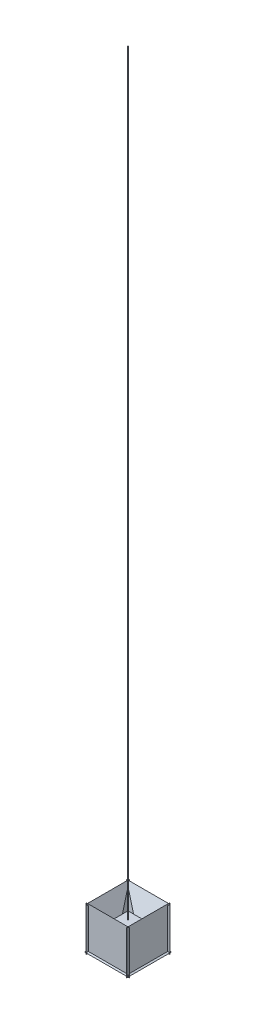
ISO-10303-21;
HEADER;
FILE_DESCRIPTION(('STEP AP214'),'2;1');
FILE_NAME('part.step','',(''),(''),'','','');
FILE_SCHEMA(('AUTOMOTIVE_DESIGN { 1 0 10303 214 1 1 1 1 }'));
ENDSEC;
DATA;
#1=APPLICATION_CONTEXT('core data for automotive mechanical design processes');
#2=APPLICATION_PROTOCOL_DEFINITION('international standard','automotive_design',2000,#1);
#3=PRODUCT_CONTEXT('',#1,'mechanical');
#4=PRODUCT('Part','Part','',(#3));
#5=PRODUCT_RELATED_PRODUCT_CATEGORY('part','',(#4));
#6=PRODUCT_DEFINITION_FORMATION('','',#4);
#7=PRODUCT_DEFINITION_CONTEXT('part definition',#1,'design');
#8=PRODUCT_DEFINITION('design','',#6,#7);
#9=PRODUCT_DEFINITION_SHAPE('','',#8);
#10=(LENGTH_UNIT() NAMED_UNIT(*) SI_UNIT(.MILLI.,.METRE.));
#11=(NAMED_UNIT(*) PLANE_ANGLE_UNIT() SI_UNIT($,.RADIAN.));
#12=(NAMED_UNIT(*) SI_UNIT($,.STERADIAN.) SOLID_ANGLE_UNIT());
#13=UNCERTAINTY_MEASURE_WITH_UNIT(LENGTH_MEASURE(1.E-05),#10,'distance_accuracy_value','');
#14=(GEOMETRIC_REPRESENTATION_CONTEXT(3) GLOBAL_UNCERTAINTY_ASSIGNED_CONTEXT((#13)) GLOBAL_UNIT_ASSIGNED_CONTEXT((#10,
#11,#12)) REPRESENTATION_CONTEXT('',''));
#15=CARTESIAN_POINT('',(0.,0.,0.));
#16=DIRECTION('',(0.,0.,1.));
#17=DIRECTION('',(1.,0.,0.));
#18=AXIS2_PLACEMENT_3D('',#15,#16,#17);
#19=CARTESIAN_POINT('',(267.74991161534,0.,-2.80453145964557E-12));
#20=DIRECTION('',(-1.,0.,0.));
#21=DIRECTION('',(0.,0.,1.));
#22=AXIS2_PLACEMENT_3D('',#19,#20,#21);
#23=PLANE('',#22);
#24=DIRECTION('',(0.,-1.,0.));
#25=VECTOR('',#24,1.);
#26=CARTESIAN_POINT('',(267.749911615337,-287.780088590849,-287.780088590851));
#27=LINE('',#26,#25);
#28=CARTESIAN_POINT('',(267.749911615337,287.780088590849,-287.780088590851));
#29=VERTEX_POINT('',#28);
#30=CARTESIAN_POINT('',(267.749911615337,-287.780088590849,-287.780088590851));
#31=VERTEX_POINT('',#30);
#32=EDGE_CURVE('E142',#29,#31,#27,.T.);
#33=ORIENTED_EDGE('',*,*,#32,.F.);
#34=DIRECTION('',(0.,0.,-1.));
#35=VECTOR('',#34,1.);
#36=CARTESIAN_POINT('',(267.749911615343,287.780088590849,287.780088590846));
#37=LINE('',#36,#35);
#38=CARTESIAN_POINT('',(267.749911615343,287.780088590849,287.780088590846));
#39=VERTEX_POINT('',#38);
#40=EDGE_CURVE('E72',#39,#29,#37,.T.);
#41=ORIENTED_EDGE('',*,*,#40,.F.);
#42=DIRECTION('',(0.,1.,0.));
#43=VECTOR('',#42,1.);
#44=CARTESIAN_POINT('',(267.749911615343,-287.780088590849,287.780088590846));
#45=LINE('',#44,#43);
#46=CARTESIAN_POINT('',(267.749911615343,-287.780088590849,287.780088590846));
#47=VERTEX_POINT('',#46);
#48=EDGE_CURVE('E80',#47,#39,#45,.T.);
#49=ORIENTED_EDGE('',*,*,#48,.F.);
#50=DIRECTION('',(0.,0.,1.));
#51=VECTOR('',#50,1.);
#52=CARTESIAN_POINT('',(267.749911615343,-287.780088590849,287.780088590846));
#53=LINE('',#52,#51);
#54=EDGE_CURVE('E96',#31,#47,#53,.T.);
#55=ORIENTED_EDGE('',*,*,#54,.F.);
#56=EDGE_LOOP('',(#33,#41,#49,#55));
#57=FACE_BOUND('',#56,.T.);
#58=ADVANCED_FACE('F52',(#57),#23,.F.);
#59=CARTESIAN_POINT('',(76.1999999999998,0.,-43.9940905122502));
#60=DIRECTION('',(-0.866025403784435,0.,0.500000000000007));
#61=DIRECTION('',(0.500000000000007,0.,0.866025403784435));
#62=AXIS2_PLACEMENT_3D('',#59,#60,#61);
#63=PLANE('',#62);
#64=DIRECTION('',(0.377964473009232,-0.654653670707978,0.654653670707974));
#65=VECTOR('',#64,1.);
#66=CARTESIAN_POINT('',(101.6,0.,-1.06420351207939E-12));
#67=LINE('',#66,#65);
#68=CARTESIAN_POINT('',(101.6,0.,-1.06420351207939E-12));
#69=VERTEX_POINT('',#68);
#70=EDGE_CURVE('E90',#69,#47,#67,.T.);
#71=ORIENTED_EDGE('',*,*,#70,.T.);
#72=ORIENTED_EDGE('',*,*,#48,.T.);
#73=DIRECTION('',(0.377964473009232,0.654653670707978,0.654653670707974));
#74=VECTOR('',#73,1.);
#75=CARTESIAN_POINT('',(101.6,0.,-1.06420351207939E-12));
#76=LINE('',#75,#74);
#77=EDGE_CURVE('E93',#69,#39,#76,.T.);
#78=ORIENTED_EDGE('',*,*,#77,.F.);
#79=EDGE_LOOP('',(#71,#72,#78));
#80=FACE_BOUND('',#79,.T.);
#81=ADVANCED_FACE('F92',(#80),#63,.T.);
#82=CARTESIAN_POINT('',(76.2000000000002,-43.9940905122494,-7.98152634059543E-13));
#83=DIRECTION('',(-0.86602540378444,0.499999999999998,0.));
#84=DIRECTION('',(-0.499999999999998,-0.86602540378444,0.));
#85=AXIS2_PLACEMENT_3D('',#82,#83,#84);
#86=PLANE('',#85);
#87=ORIENTED_EDGE('',*,*,#77,.T.);
#88=ORIENTED_EDGE('',*,*,#40,.T.);
#89=DIRECTION('',(0.377964473009219,0.654653670707978,-0.654653670707982));
#90=VECTOR('',#89,1.);
#91=CARTESIAN_POINT('',(101.6,0.,-1.06420351207939E-12));
#92=LINE('',#91,#90);
#93=EDGE_CURVE('E13',#69,#29,#92,.T.);
#94=ORIENTED_EDGE('',*,*,#93,.F.);
#95=EDGE_LOOP('',(#87,#88,#94));
#96=FACE_BOUND('',#95,.T.);
#97=ADVANCED_FACE('F164',(#96),#86,.T.);
#98=CARTESIAN_POINT('',(76.2000000000002,43.9940905122494,-7.98152634059543E-13));
#99=DIRECTION('',(-0.86602540378444,-0.499999999999998,0.));
#100=DIRECTION('',(0.499999999999998,-0.86602540378444,0.));
#101=AXIS2_PLACEMENT_3D('',#98,#99,#100);
#102=PLANE('',#101);
#103=DIRECTION('',(0.377964473009219,-0.654653670707978,-0.654653670707982));
#104=VECTOR('',#103,1.);
#105=CARTESIAN_POINT('',(101.6,0.,-1.06420351207939E-12));
#106=LINE('',#105,#104);
#107=EDGE_CURVE('E64',#69,#31,#106,.T.);
#108=ORIENTED_EDGE('',*,*,#107,.T.);
#109=ORIENTED_EDGE('',*,*,#54,.T.);
#110=ORIENTED_EDGE('',*,*,#70,.F.);
#111=EDGE_LOOP('',(#108,#109,#110));
#112=FACE_BOUND('',#111,.T.);
#113=ADVANCED_FACE('F99',(#112),#102,.T.);
#114=CARTESIAN_POINT('',(76.2000000000007,0.,43.9940905122486));
#115=DIRECTION('',(-0.866025403784445,0.,-0.499999999999989));
#116=DIRECTION('',(-0.499999999999989,0.,0.866025403784445));
#117=AXIS2_PLACEMENT_3D('',#114,#115,#116);
#118=PLANE('',#117);
#119=ORIENTED_EDGE('',*,*,#93,.T.);
#120=ORIENTED_EDGE('',*,*,#32,.T.);
#121=ORIENTED_EDGE('',*,*,#107,.F.);
#122=EDGE_LOOP('',(#119,#120,#121));
#123=FACE_BOUND('',#122,.T.);
#124=ADVANCED_FACE('F54',(#123),#118,.T.);
#125=CLOSED_SHELL('',(#58,#81,#97,#113,#124));
#126=MANIFOLD_SOLID_BREP('B2',#125);
#127=CARTESIAN_POINT('',(0.,0.,267.74991161534));
#128=DIRECTION('',(0.,0.,-1.));
#129=DIRECTION('',(-1.,0.,0.));
#130=AXIS2_PLACEMENT_3D('',#127,#128,#129);
#131=PLANE('',#130);
#132=DIRECTION('',(0.,-1.,0.));
#133=VECTOR('',#132,1.);
#134=CARTESIAN_POINT('',(287.780088590849,-287.780088590849,267.74991161534));
#135=LINE('',#134,#133);
#136=CARTESIAN_POINT('',(287.780088590849,287.780088590849,267.74991161534));
#137=VERTEX_POINT('',#136);
#138=CARTESIAN_POINT('',(287.780088590849,-287.780088590849,267.74991161534));
#139=VERTEX_POINT('',#138);
#140=EDGE_CURVE('E350',#137,#139,#135,.T.);
#141=ORIENTED_EDGE('',*,*,#140,.F.);
#142=DIRECTION('',(1.,0.,0.));
#143=VECTOR('',#142,1.);
#144=CARTESIAN_POINT('',(-287.780088590849,287.780088590849,267.74991161534));
#145=LINE('',#144,#143);
#146=CARTESIAN_POINT('',(-287.780088590849,287.780088590849,267.74991161534));
#147=VERTEX_POINT('',#146);
#148=EDGE_CURVE('E280',#147,#137,#145,.T.);
#149=ORIENTED_EDGE('',*,*,#148,.F.);
#150=DIRECTION('',(0.,1.,0.));
#151=VECTOR('',#150,1.);
#152=CARTESIAN_POINT('',(-287.780088590849,-287.780088590849,267.74991161534));
#153=LINE('',#152,#151);
#154=CARTESIAN_POINT('',(-287.780088590849,-287.780088590849,267.74991161534));
#155=VERTEX_POINT('',#154);
#156=EDGE_CURVE('E288',#155,#147,#153,.T.);
#157=ORIENTED_EDGE('',*,*,#156,.F.);
#158=DIRECTION('',(-1.,0.,0.));
#159=VECTOR('',#158,1.);
#160=CARTESIAN_POINT('',(-287.780088590849,-287.780088590849,267.74991161534));
#161=LINE('',#160,#159);
#162=EDGE_CURVE('E304',#139,#155,#161,.T.);
#163=ORIENTED_EDGE('',*,*,#162,.F.);
#164=EDGE_LOOP('',(#141,#149,#157,#163));
#165=FACE_BOUND('',#164,.T.);
#166=ADVANCED_FACE('F260',(#165),#131,.F.);
#167=CARTESIAN_POINT('',(43.9940905122494,0.,76.2000000000002));
#168=DIRECTION('',(-0.499999999999998,0.,-0.86602540378444));
#169=DIRECTION('',(-0.86602540378444,0.,0.499999999999998));
#170=AXIS2_PLACEMENT_3D('',#167,#168,#169);
#171=PLANE('',#170);
#172=DIRECTION('',(-0.654653670707978,-0.654653670707978,0.377964473009226));
#173=VECTOR('',#172,1.);
#174=CARTESIAN_POINT('',(0.,0.,101.6));
#175=LINE('',#174,#173);
#176=CARTESIAN_POINT('',(0.,0.,101.6));
#177=VERTEX_POINT('',#176);
#178=EDGE_CURVE('E298',#177,#155,#175,.T.);
#179=ORIENTED_EDGE('',*,*,#178,.T.);
#180=ORIENTED_EDGE('',*,*,#156,.T.);
#181=DIRECTION('',(-0.654653670707978,0.654653670707978,0.377964473009226));
#182=VECTOR('',#181,1.);
#183=CARTESIAN_POINT('',(0.,0.,101.6));
#184=LINE('',#183,#182);
#185=EDGE_CURVE('E301',#177,#147,#184,.T.);
#186=ORIENTED_EDGE('',*,*,#185,.F.);
#187=EDGE_LOOP('',(#179,#180,#186));
#188=FACE_BOUND('',#187,.T.);
#189=ADVANCED_FACE('F300',(#188),#171,.T.);
#190=CARTESIAN_POINT('',(0.,-43.9940905122494,76.2000000000002));
#191=DIRECTION('',(0.,0.499999999999998,-0.86602540378444));
#192=DIRECTION('',(0.,-0.86602540378444,-0.499999999999998));
#193=AXIS2_PLACEMENT_3D('',#190,#191,#192);
#194=PLANE('',#193);
#195=ORIENTED_EDGE('',*,*,#185,.T.);
#196=ORIENTED_EDGE('',*,*,#148,.T.);
#197=DIRECTION('',(0.654653670707978,0.654653670707978,0.377964473009226));
#198=VECTOR('',#197,1.);
#199=CARTESIAN_POINT('',(0.,0.,101.6));
#200=LINE('',#199,#198);
#201=EDGE_CURVE('E50',#177,#137,#200,.T.);
#202=ORIENTED_EDGE('',*,*,#201,.F.);
#203=EDGE_LOOP('',(#195,#196,#202));
#204=FACE_BOUND('',#203,.T.);
#205=ADVANCED_FACE('F372',(#204),#194,.T.);
#206=CARTESIAN_POINT('',(0.,43.9940905122494,76.2000000000002));
#207=DIRECTION('',(0.,-0.499999999999998,-0.86602540378444));
#208=DIRECTION('',(0.,-0.86602540378444,0.499999999999998));
#209=AXIS2_PLACEMENT_3D('',#206,#207,#208);
#210=PLANE('',#209);
#211=DIRECTION('',(0.654653670707978,-0.654653670707978,0.377964473009226));
#212=VECTOR('',#211,1.);
#213=CARTESIAN_POINT('',(0.,0.,101.6));
#214=LINE('',#213,#212);
#215=EDGE_CURVE('E272',#177,#139,#214,.T.);
#216=ORIENTED_EDGE('',*,*,#215,.T.);
#217=ORIENTED_EDGE('',*,*,#162,.T.);
#218=ORIENTED_EDGE('',*,*,#178,.F.);
#219=EDGE_LOOP('',(#216,#217,#218));
#220=FACE_BOUND('',#219,.T.);
#221=ADVANCED_FACE('F307',(#220),#210,.T.);
#222=CARTESIAN_POINT('',(-43.9940905122494,0.,76.2000000000002));
#223=DIRECTION('',(0.499999999999998,0.,-0.86602540378444));
#224=DIRECTION('',(-0.86602540378444,0.,-0.499999999999998));
#225=AXIS2_PLACEMENT_3D('',#222,#223,#224);
#226=PLANE('',#225);
#227=ORIENTED_EDGE('',*,*,#201,.T.);
#228=ORIENTED_EDGE('',*,*,#140,.T.);
#229=ORIENTED_EDGE('',*,*,#215,.F.);
#230=EDGE_LOOP('',(#227,#228,#229));
#231=FACE_BOUND('',#230,.T.);
#232=ADVANCED_FACE('F262',(#231),#226,.T.);
#233=CLOSED_SHELL('',(#166,#189,#205,#221,#232));
#234=MANIFOLD_SOLID_BREP('B7',#233);
#235=CARTESIAN_POINT('',(-267.74991161534,0.,9.34843819881858E-13));
#236=DIRECTION('',(1.,0.,0.));
#237=DIRECTION('',(0.,0.,-1.));
#238=AXIS2_PLACEMENT_3D('',#235,#236,#237);
#239=PLANE('',#238);
#240=DIRECTION('',(0.,-1.,0.));
#241=VECTOR('',#240,1.);
#242=CARTESIAN_POINT('',(-267.749911615339,-287.780088590849,287.780088590849));
#243=LINE('',#242,#241);
#244=CARTESIAN_POINT('',(-267.749911615339,287.780088590849,287.780088590849));
#245=VERTEX_POINT('',#244);
#246=CARTESIAN_POINT('',(-267.749911615339,-287.780088590849,287.780088590849));
#247=VERTEX_POINT('',#246);
#248=EDGE_CURVE('E558',#245,#247,#243,.T.);
#249=ORIENTED_EDGE('',*,*,#248,.F.);
#250=DIRECTION('',(0.,0.,1.));
#251=VECTOR('',#250,1.);
#252=CARTESIAN_POINT('',(-267.749911615341,287.780088590849,-287.780088590848));
#253=LINE('',#252,#251);
#254=CARTESIAN_POINT('',(-267.749911615341,287.780088590849,-287.780088590848));
#255=VERTEX_POINT('',#254);
#256=EDGE_CURVE('E488',#255,#245,#253,.T.);
#257=ORIENTED_EDGE('',*,*,#256,.F.);
#258=DIRECTION('',(0.,1.,0.));
#259=VECTOR('',#258,1.);
#260=CARTESIAN_POINT('',(-267.749911615341,-287.780088590849,-287.780088590848));
#261=LINE('',#260,#259);
#262=CARTESIAN_POINT('',(-267.749911615341,-287.780088590849,-287.780088590848));
#263=VERTEX_POINT('',#262);
#264=EDGE_CURVE('E496',#263,#255,#261,.T.);
#265=ORIENTED_EDGE('',*,*,#264,.F.);
#266=DIRECTION('',(0.,0.,-1.));
#267=VECTOR('',#266,1.);
#268=CARTESIAN_POINT('',(-267.749911615341,-287.780088590849,-287.780088590848));
#269=LINE('',#268,#267);
#270=EDGE_CURVE('E512',#247,#263,#269,.T.);
#271=ORIENTED_EDGE('',*,*,#270,.F.);
#272=EDGE_LOOP('',(#249,#257,#265,#271));
#273=FACE_BOUND('',#272,.T.);
#274=ADVANCED_FACE('F468',(#273),#239,.F.);
#275=CARTESIAN_POINT('',(-76.2000000000001,0.,43.9940905122496));
#276=DIRECTION('',(0.866025403784438,0.,-0.500000000000001));
#277=DIRECTION('',(-0.500000000000001,0.,-0.866025403784438));
#278=AXIS2_PLACEMENT_3D('',#275,#276,#277);
#279=PLANE('',#278);
#280=DIRECTION('',(-0.377964473009228,-0.654653670707978,-0.654653670707976));
#281=VECTOR('',#280,1.);
#282=CARTESIAN_POINT('',(-101.6,0.,3.54734504026462E-13));
#283=LINE('',#282,#281);
#284=CARTESIAN_POINT('',(-101.6,0.,3.54734504026462E-13));
#285=VERTEX_POINT('',#284);
#286=EDGE_CURVE('E506',#285,#263,#283,.T.);
#287=ORIENTED_EDGE('',*,*,#286,.T.);
#288=ORIENTED_EDGE('',*,*,#264,.T.);
#289=DIRECTION('',(-0.377964473009228,0.654653670707978,-0.654653670707976));
#290=VECTOR('',#289,1.);
#291=CARTESIAN_POINT('',(-101.6,0.,3.54734504026462E-13));
#292=LINE('',#291,#290);
#293=EDGE_CURVE('E509',#285,#255,#292,.T.);
#294=ORIENTED_EDGE('',*,*,#293,.F.);
#295=EDGE_LOOP('',(#287,#288,#294));
#296=FACE_BOUND('',#295,.T.);
#297=ADVANCED_FACE('F508',(#296),#279,.T.);
#298=CARTESIAN_POINT('',(-76.2000000000002,-43.9940905122494,2.66050878019848E-13));
#299=DIRECTION('',(0.86602540378444,0.499999999999998,0.));
#300=DIRECTION('',(0.499999999999998,-0.86602540378444,0.));
#301=AXIS2_PLACEMENT_3D('',#298,#299,#300);
#302=PLANE('',#301);
#303=ORIENTED_EDGE('',*,*,#293,.T.);
#304=ORIENTED_EDGE('',*,*,#256,.T.);
#305=DIRECTION('',(-0.377964473009223,0.654653670707978,0.654653670707979));
#306=VECTOR('',#305,1.);
#307=CARTESIAN_POINT('',(-101.6,0.,3.54734504026462E-13));
#308=LINE('',#307,#306);
#309=EDGE_CURVE('E258',#285,#245,#308,.T.);
#310=ORIENTED_EDGE('',*,*,#309,.F.);
#311=EDGE_LOOP('',(#303,#304,#310));
#312=FACE_BOUND('',#311,.T.);
#313=ADVANCED_FACE('F580',(#312),#302,.T.);
#314=CARTESIAN_POINT('',(-76.2000000000002,43.9940905122494,2.66050878019848E-13));
#315=DIRECTION('',(0.86602540378444,-0.499999999999998,0.));
#316=DIRECTION('',(-0.499999999999998,-0.86602540378444,0.));
#317=AXIS2_PLACEMENT_3D('',#314,#315,#316);
#318=PLANE('',#317);
#319=DIRECTION('',(-0.377964473009223,-0.654653670707978,0.654653670707979));
#320=VECTOR('',#319,1.);
#321=CARTESIAN_POINT('',(-101.6,0.,3.54734504026462E-13));
#322=LINE('',#321,#320);
#323=EDGE_CURVE('E480',#285,#247,#322,.T.);
#324=ORIENTED_EDGE('',*,*,#323,.T.);
#325=ORIENTED_EDGE('',*,*,#270,.T.);
#326=ORIENTED_EDGE('',*,*,#286,.F.);
#327=EDGE_LOOP('',(#324,#325,#326));
#328=FACE_BOUND('',#327,.T.);
#329=ADVANCED_FACE('F515',(#328),#318,.T.);
#330=CARTESIAN_POINT('',(-76.2000000000004,0.,-43.9940905122491));
#331=DIRECTION('',(0.866025403784442,0.,0.499999999999995));
#332=DIRECTION('',(0.499999999999995,0.,-0.866025403784442));
#333=AXIS2_PLACEMENT_3D('',#330,#331,#332);
#334=PLANE('',#333);
#335=ORIENTED_EDGE('',*,*,#309,.T.);
#336=ORIENTED_EDGE('',*,*,#248,.T.);
#337=ORIENTED_EDGE('',*,*,#323,.F.);
#338=EDGE_LOOP('',(#335,#336,#337));
#339=FACE_BOUND('',#338,.T.);
#340=ADVANCED_FACE('F470',(#339),#334,.T.);
#341=CLOSED_SHELL('',(#274,#297,#313,#329,#340));
#342=MANIFOLD_SOLID_BREP('B44',#341);
#343=CARTESIAN_POINT('',(0.,0.,267.74991161534));
#344=DIRECTION('',(0.,0.,-1.));
#345=DIRECTION('',(1.,0.,0.));
#346=AXIS2_PLACEMENT_3D('',#343,#344,#345);
#347=PLANE('',#346);
#348=DIRECTION('',(0.,1.,0.));
#349=VECTOR('',#348,1.);
#350=CARTESIAN_POINT('',(-287.780088590849,287.780088590848,267.74991161534));
#351=LINE('',#350,#349);
#352=CARTESIAN_POINT('',(-287.780088590848,-287.780088590849,267.74991161534));
#353=VERTEX_POINT('',#352);
#354=CARTESIAN_POINT('',(-287.780088590849,287.780088590848,267.74991161534));
#355=VERTEX_POINT('',#354);
#356=EDGE_CURVE('E766',#353,#355,#351,.T.);
#357=ORIENTED_EDGE('',*,*,#356,.F.);
#358=DIRECTION('',(-1.,0.,0.));
#359=VECTOR('',#358,1.);
#360=CARTESIAN_POINT('',(287.780088590849,-287.780088590848,267.74991161534));
#361=LINE('',#360,#359);
#362=CARTESIAN_POINT('',(287.780088590849,-287.780088590848,267.74991161534));
#363=VERTEX_POINT('',#362);
#364=EDGE_CURVE('E696',#363,#353,#361,.T.);
#365=ORIENTED_EDGE('',*,*,#364,.F.);
#366=DIRECTION('',(0.,-1.,0.));
#367=VECTOR('',#366,1.);
#368=CARTESIAN_POINT('',(287.780088590848,287.780088590849,267.74991161534));
#369=LINE('',#368,#367);
#370=CARTESIAN_POINT('',(287.780088590848,287.780088590849,267.74991161534));
#371=VERTEX_POINT('',#370);
#372=EDGE_CURVE('E704',#371,#363,#369,.T.);
#373=ORIENTED_EDGE('',*,*,#372,.F.);
#374=DIRECTION('',(1.,0.,0.));
#375=VECTOR('',#374,1.);
#376=CARTESIAN_POINT('',(287.780088590848,287.780088590849,267.74991161534));
#377=LINE('',#376,#375);
#378=EDGE_CURVE('E720',#355,#371,#377,.T.);
#379=ORIENTED_EDGE('',*,*,#378,.F.);
#380=EDGE_LOOP('',(#357,#365,#373,#379));
#381=FACE_BOUND('',#380,.T.);
#382=ADVANCED_FACE('F676',(#381),#347,.F.);
#383=CARTESIAN_POINT('',(-43.9940905122494,0.,76.2000000000002));
#384=DIRECTION('',(0.499999999999998,0.,-0.86602540378444));
#385=DIRECTION('',(0.86602540378444,0.,0.499999999999998));
#386=AXIS2_PLACEMENT_3D('',#383,#384,#385);
#387=PLANE('',#386);
#388=DIRECTION('',(0.654653670707977,0.654653670707978,0.377964473009226));
#389=VECTOR('',#388,1.);
#390=CARTESIAN_POINT('',(0.,0.,101.6));
#391=LINE('',#390,#389);
#392=CARTESIAN_POINT('',(0.,0.,101.6));
#393=VERTEX_POINT('',#392);
#394=EDGE_CURVE('E714',#393,#371,#391,.T.);
#395=ORIENTED_EDGE('',*,*,#394,.T.);
#396=ORIENTED_EDGE('',*,*,#372,.T.);
#397=DIRECTION('',(0.654653670707978,-0.654653670707977,0.377964473009226));
#398=VECTOR('',#397,1.);
#399=CARTESIAN_POINT('',(0.,0.,101.6));
#400=LINE('',#399,#398);
#401=EDGE_CURVE('E717',#393,#363,#400,.T.);
#402=ORIENTED_EDGE('',*,*,#401,.F.);
#403=EDGE_LOOP('',(#395,#396,#402));
#404=FACE_BOUND('',#403,.T.);
#405=ADVANCED_FACE('F716',(#404),#387,.T.);
#406=CARTESIAN_POINT('',(0.,43.9940905122494,76.2000000000002));
#407=DIRECTION('',(0.,-0.499999999999998,-0.86602540378444));
#408=DIRECTION('',(0.,0.86602540378444,-0.499999999999998));
#409=AXIS2_PLACEMENT_3D('',#406,#407,#408);
#410=PLANE('',#409);
#411=ORIENTED_EDGE('',*,*,#401,.T.);
#412=ORIENTED_EDGE('',*,*,#364,.T.);
#413=DIRECTION('',(-0.654653670707977,-0.654653670707978,0.377964473009226));
#414=VECTOR('',#413,1.);
#415=CARTESIAN_POINT('',(0.,0.,101.6));
#416=LINE('',#415,#414);
#417=EDGE_CURVE('E466',#393,#353,#416,.T.);
#418=ORIENTED_EDGE('',*,*,#417,.F.);
#419=EDGE_LOOP('',(#411,#412,#418));
#420=FACE_BOUND('',#419,.T.);
#421=ADVANCED_FACE('F788',(#420),#410,.T.);
#422=CARTESIAN_POINT('',(0.,-43.9940905122494,76.2000000000002));
#423=DIRECTION('',(0.,0.499999999999998,-0.86602540378444));
#424=DIRECTION('',(0.,0.86602540378444,0.499999999999998));
#425=AXIS2_PLACEMENT_3D('',#422,#423,#424);
#426=PLANE('',#425);
#427=DIRECTION('',(-0.654653670707978,0.654653670707977,0.377964473009226));
#428=VECTOR('',#427,1.);
#429=CARTESIAN_POINT('',(0.,0.,101.6));
#430=LINE('',#429,#428);
#431=EDGE_CURVE('E688',#393,#355,#430,.T.);
#432=ORIENTED_EDGE('',*,*,#431,.T.);
#433=ORIENTED_EDGE('',*,*,#378,.T.);
#434=ORIENTED_EDGE('',*,*,#394,.F.);
#435=EDGE_LOOP('',(#432,#433,#434));
#436=FACE_BOUND('',#435,.T.);
#437=ADVANCED_FACE('F723',(#436),#426,.T.);
#438=CARTESIAN_POINT('',(43.9940905122494,0.,76.2000000000002));
#439=DIRECTION('',(-0.499999999999998,0.,-0.86602540378444));
#440=DIRECTION('',(0.86602540378444,0.,-0.499999999999998));
#441=AXIS2_PLACEMENT_3D('',#438,#439,#440);
#442=PLANE('',#441);
#443=ORIENTED_EDGE('',*,*,#417,.T.);
#444=ORIENTED_EDGE('',*,*,#356,.T.);
#445=ORIENTED_EDGE('',*,*,#431,.F.);
#446=EDGE_LOOP('',(#443,#444,#445));
#447=FACE_BOUND('',#446,.T.);
#448=ADVANCED_FACE('F678',(#447),#442,.T.);
#449=CLOSED_SHELL('',(#382,#405,#421,#437,#448));
#450=MANIFOLD_SOLID_BREP('B252',#449);
#451=CARTESIAN_POINT('',(0.,-267.74991161534,9.34843819881858E-13));
#452=DIRECTION('',(0.,1.,0.));
#453=DIRECTION('',(1.,0.,0.));
#454=AXIS2_PLACEMENT_3D('',#451,#452,#453);
#455=PLANE('',#454);
#456=DIRECTION('',(0.,0.,1.));
#457=VECTOR('',#456,1.);
#458=CARTESIAN_POINT('',(-287.780088590849,-267.749911615339,287.780088590849));
#459=LINE('',#458,#457);
#460=CARTESIAN_POINT('',(-287.780088590848,-267.749911615341,-287.780088590848));
#461=VERTEX_POINT('',#460);
#462=CARTESIAN_POINT('',(-287.780088590849,-267.749911615339,287.780088590849));
#463=VERTEX_POINT('',#462);
#464=EDGE_CURVE('E974',#461,#463,#459,.T.);
#465=ORIENTED_EDGE('',*,*,#464,.F.);
#466=DIRECTION('',(-1.,0.,0.));
#467=VECTOR('',#466,1.);
#468=CARTESIAN_POINT('',(287.780088590849,-267.749911615341,-287.780088590847));
#469=LINE('',#468,#467);
#470=CARTESIAN_POINT('',(287.780088590849,-267.749911615341,-287.780088590847));
#471=VERTEX_POINT('',#470);
#472=EDGE_CURVE('E904',#471,#461,#469,.T.);
#473=ORIENTED_EDGE('',*,*,#472,.F.);
#474=DIRECTION('',(0.,0.,-1.));
#475=VECTOR('',#474,1.);
#476=CARTESIAN_POINT('',(287.780088590848,-267.749911615339,287.78008859085));
#477=LINE('',#476,#475);
#478=CARTESIAN_POINT('',(287.780088590848,-267.749911615339,287.78008859085));
#479=VERTEX_POINT('',#478);
#480=EDGE_CURVE('E912',#479,#471,#477,.T.);
#481=ORIENTED_EDGE('',*,*,#480,.F.);
#482=DIRECTION('',(1.,0.,0.));
#483=VECTOR('',#482,1.);
#484=CARTESIAN_POINT('',(287.780088590848,-267.749911615339,287.78008859085));
#485=LINE('',#484,#483);
#486=EDGE_CURVE('E928',#463,#479,#485,.T.);
#487=ORIENTED_EDGE('',*,*,#486,.F.);
#488=EDGE_LOOP('',(#465,#473,#481,#487));
#489=FACE_BOUND('',#488,.T.);
#490=ADVANCED_FACE('F884',(#489),#455,.F.);
#491=CARTESIAN_POINT('',(-43.9940905122494,-76.2000000000002,2.52581572488041E-13));
#492=DIRECTION('',(0.499999999999998,0.86602540378444,0.));
#493=DIRECTION('',(0.86602540378444,-0.499999999999998,0.));
#494=AXIS2_PLACEMENT_3D('',#491,#492,#493);
#495=PLANE('',#494);
#496=DIRECTION('',(0.654653670707978,-0.377964473009223,0.654653670707979));
#497=VECTOR('',#496,1.);
#498=CARTESIAN_POINT('',(0.,-101.6,3.54734504026462E-13));
#499=LINE('',#498,#497);
#500=CARTESIAN_POINT('',(0.,-101.6,3.54734504026462E-13));
#501=VERTEX_POINT('',#500);
#502=EDGE_CURVE('E922',#501,#479,#499,.T.);
#503=ORIENTED_EDGE('',*,*,#502,.T.);
#504=ORIENTED_EDGE('',*,*,#480,.T.);
#505=DIRECTION('',(0.654653670707978,-0.377964473009228,-0.654653670707976));
#506=VECTOR('',#505,1.);
#507=CARTESIAN_POINT('',(0.,-101.6,3.54734504026462E-13));
#508=LINE('',#507,#506);
#509=EDGE_CURVE('E925',#501,#471,#508,.T.);
#510=ORIENTED_EDGE('',*,*,#509,.F.);
#511=EDGE_LOOP('',(#503,#504,#510));
#512=FACE_BOUND('',#511,.T.);
#513=ADVANCED_FACE('F924',(#512),#495,.T.);
#514=CARTESIAN_POINT('',(0.,-76.2000000000001,43.9940905122496));
#515=DIRECTION('',(0.,0.866025403784438,-0.500000000000001));
#516=DIRECTION('',(0.,0.500000000000001,0.866025403784438));
#517=AXIS2_PLACEMENT_3D('',#514,#515,#516);
#518=PLANE('',#517);
#519=ORIENTED_EDGE('',*,*,#509,.T.);
#520=ORIENTED_EDGE('',*,*,#472,.T.);
#521=DIRECTION('',(-0.654653670707977,-0.377964473009228,-0.654653670707977));
#522=VECTOR('',#521,1.);
#523=CARTESIAN_POINT('',(0.,-101.6,3.54734504026462E-13));
#524=LINE('',#523,#522);
#525=EDGE_CURVE('E674',#501,#461,#524,.T.);
#526=ORIENTED_EDGE('',*,*,#525,.F.);
#527=EDGE_LOOP('',(#519,#520,#526));
#528=FACE_BOUND('',#527,.T.);
#529=ADVANCED_FACE('F996',(#528),#518,.T.);
#530=CARTESIAN_POINT('',(0.,-76.2000000000004,-43.9940905122491));
#531=DIRECTION('',(0.,0.866025403784442,0.499999999999995));
#532=DIRECTION('',(0.,-0.499999999999995,0.866025403784442));
#533=AXIS2_PLACEMENT_3D('',#530,#531,#532);
#534=PLANE('',#533);
#535=DIRECTION('',(-0.654653670707978,-0.377964473009223,0.654653670707979));
#536=VECTOR('',#535,1.);
#537=CARTESIAN_POINT('',(0.,-101.6,3.54734504026462E-13));
#538=LINE('',#537,#536);
#539=EDGE_CURVE('E896',#501,#463,#538,.T.);
#540=ORIENTED_EDGE('',*,*,#539,.T.);
#541=ORIENTED_EDGE('',*,*,#486,.T.);
#542=ORIENTED_EDGE('',*,*,#502,.F.);
#543=EDGE_LOOP('',(#540,#541,#542));
#544=FACE_BOUND('',#543,.T.);
#545=ADVANCED_FACE('F931',(#544),#534,.T.);
#546=CARTESIAN_POINT('',(43.9940905122494,-76.2000000000002,2.79520183551654E-13));
#547=DIRECTION('',(-0.499999999999998,0.86602540378444,0.));
#548=DIRECTION('',(0.86602540378444,0.499999999999998,0.));
#549=AXIS2_PLACEMENT_3D('',#546,#547,#548);
#550=PLANE('',#549);
#551=ORIENTED_EDGE('',*,*,#525,.T.);
#552=ORIENTED_EDGE('',*,*,#464,.T.);
#553=ORIENTED_EDGE('',*,*,#539,.F.);
#554=EDGE_LOOP('',(#551,#552,#553));
#555=FACE_BOUND('',#554,.T.);
#556=ADVANCED_FACE('F886',(#555),#550,.T.);
#557=CLOSED_SHELL('',(#490,#513,#529,#545,#556));
#558=MANIFOLD_SOLID_BREP('B460',#557);
#559=CARTESIAN_POINT('',(0.,0.,-267.74991161534));
#560=DIRECTION('',(0.,0.,1.));
#561=DIRECTION('',(1.,0.,0.));
#562=AXIS2_PLACEMENT_3D('',#559,#560,#561);
#563=PLANE('',#562);
#564=DIRECTION('',(0.,-1.,0.));
#565=VECTOR('',#564,1.);
#566=CARTESIAN_POINT('',(-287.780088590849,-287.780088590849,-267.74991161534));
#567=LINE('',#566,#565);
#568=CARTESIAN_POINT('',(-287.780088590849,287.780088590849,-267.74991161534));
#569=VERTEX_POINT('',#568);
#570=CARTESIAN_POINT('',(-287.780088590849,-287.780088590849,-267.74991161534));
#571=VERTEX_POINT('',#570);
#572=EDGE_CURVE('E1181',#569,#571,#567,.T.);
#573=ORIENTED_EDGE('',*,*,#572,.F.);
#574=DIRECTION('',(-1.,0.,0.));
#575=VECTOR('',#574,1.);
#576=CARTESIAN_POINT('',(287.780088590849,287.780088590849,-267.74991161534));
#577=LINE('',#576,#575);
#578=CARTESIAN_POINT('',(287.780088590849,287.780088590849,-267.74991161534));
#579=VERTEX_POINT('',#578);
#580=EDGE_CURVE('E1111',#579,#569,#577,.T.);
#581=ORIENTED_EDGE('',*,*,#580,.F.);
#582=DIRECTION('',(0.,1.,0.));
#583=VECTOR('',#582,1.);
#584=CARTESIAN_POINT('',(287.780088590849,-287.780088590849,-267.74991161534));
#585=LINE('',#584,#583);
#586=CARTESIAN_POINT('',(287.780088590849,-287.780088590849,-267.74991161534));
#587=VERTEX_POINT('',#586);
#588=EDGE_CURVE('E1119',#587,#579,#585,.T.);
#589=ORIENTED_EDGE('',*,*,#588,.F.);
#590=DIRECTION('',(1.,0.,0.));
#591=VECTOR('',#590,1.);
#592=CARTESIAN_POINT('',(287.780088590849,-287.780088590849,-267.74991161534));
#593=LINE('',#592,#591);
#594=EDGE_CURVE('E1135',#571,#587,#593,.T.);
#595=ORIENTED_EDGE('',*,*,#594,.F.);
#596=EDGE_LOOP('',(#573,#581,#589,#595));
#597=FACE_BOUND('',#596,.T.);
#598=ADVANCED_FACE('F1091',(#597),#563,.F.);
#599=CARTESIAN_POINT('',(-43.9940905122494,0.,-76.2000000000002));
#600=DIRECTION('',(0.499999999999998,0.,0.86602540378444));
#601=DIRECTION('',(0.86602540378444,0.,-0.499999999999998));
#602=AXIS2_PLACEMENT_3D('',#599,#600,#601);
#603=PLANE('',#602);
#604=DIRECTION('',(0.654653670707978,-0.654653670707978,-0.377964473009226));
#605=VECTOR('',#604,1.);
#606=CARTESIAN_POINT('',(0.,0.,-101.6));
#607=LINE('',#606,#605);
#608=CARTESIAN_POINT('',(0.,0.,-101.6));
#609=VERTEX_POINT('',#608);
#610=EDGE_CURVE('E1129',#609,#587,#607,.T.);
#611=ORIENTED_EDGE('',*,*,#610,.T.);
#612=ORIENTED_EDGE('',*,*,#588,.T.);
#613=DIRECTION('',(0.654653670707978,0.654653670707978,-0.377964473009226));
#614=VECTOR('',#613,1.);
#615=CARTESIAN_POINT('',(0.,0.,-101.6));
#616=LINE('',#615,#614);
#617=EDGE_CURVE('E1132',#609,#579,#616,.T.);
#618=ORIENTED_EDGE('',*,*,#617,.F.);
#619=EDGE_LOOP('',(#611,#612,#618));
#620=FACE_BOUND('',#619,.T.);
#621=ADVANCED_FACE('F1131',(#620),#603,.T.);
#622=CARTESIAN_POINT('',(0.,-43.9940905122494,-76.2000000000002));
#623=DIRECTION('',(0.,0.499999999999998,0.86602540378444));
#624=DIRECTION('',(0.,-0.86602540378444,0.499999999999998));
#625=AXIS2_PLACEMENT_3D('',#622,#623,#624);
#626=PLANE('',#625);
#627=ORIENTED_EDGE('',*,*,#617,.T.);
#628=ORIENTED_EDGE('',*,*,#580,.T.);
#629=DIRECTION('',(-0.654653670707978,0.654653670707978,-0.377964473009226));
#630=VECTOR('',#629,1.);
#631=CARTESIAN_POINT('',(0.,0.,-101.6));
#632=LINE('',#631,#630);
#633=EDGE_CURVE('E882',#609,#569,#632,.T.);
#634=ORIENTED_EDGE('',*,*,#633,.F.);
#635=EDGE_LOOP('',(#627,#628,#634));
#636=FACE_BOUND('',#635,.T.);
#637=ADVANCED_FACE('F1203',(#636),#626,.T.);
#638=CARTESIAN_POINT('',(0.,43.9940905122494,-76.2000000000002));
#639=DIRECTION('',(0.,-0.499999999999998,0.86602540378444));
#640=DIRECTION('',(0.,-0.86602540378444,-0.499999999999998));
#641=AXIS2_PLACEMENT_3D('',#638,#639,#640);
#642=PLANE('',#641);
#643=DIRECTION('',(-0.654653670707978,-0.654653670707978,-0.377964473009226));
#644=VECTOR('',#643,1.);
#645=CARTESIAN_POINT('',(0.,0.,-101.6));
#646=LINE('',#645,#644);
#647=EDGE_CURVE('E1103',#609,#571,#646,.T.);
#648=ORIENTED_EDGE('',*,*,#647,.T.);
#649=ORIENTED_EDGE('',*,*,#594,.T.);
#650=ORIENTED_EDGE('',*,*,#610,.F.);
#651=EDGE_LOOP('',(#648,#649,#650));
#652=FACE_BOUND('',#651,.T.);
#653=ADVANCED_FACE('F1138',(#652),#642,.T.);
#654=CARTESIAN_POINT('',(43.9940905122494,0.,-76.2000000000002));
#655=DIRECTION('',(-0.499999999999998,0.,0.86602540378444));
#656=DIRECTION('',(0.86602540378444,0.,0.499999999999998));
#657=AXIS2_PLACEMENT_3D('',#654,#655,#656);
#658=PLANE('',#657);
#659=ORIENTED_EDGE('',*,*,#633,.T.);
#660=ORIENTED_EDGE('',*,*,#572,.T.);
#661=ORIENTED_EDGE('',*,*,#647,.F.);
#662=EDGE_LOOP('',(#659,#660,#661));
#663=FACE_BOUND('',#662,.T.);
#664=ADVANCED_FACE('F1093',(#663),#658,.T.);
#665=CLOSED_SHELL('',(#598,#621,#637,#653,#664));
#666=MANIFOLD_SOLID_BREP('B668',#665);
#667=CARTESIAN_POINT('',(101.6,101.6,101.6));
#668=DIRECTION('',(-1.,0.,0.));
#669=DIRECTION('',(0.,0.,1.));
#670=AXIS2_PLACEMENT_3D('',#667,#668,#669);
#671=PLANE('',#670);
#672=DIRECTION('',(0.,0.,-1.));
#673=VECTOR('',#672,1.);
#674=CARTESIAN_POINT('',(101.6,-101.6,101.6));
#675=LINE('',#674,#673);
#676=CARTESIAN_POINT('',(101.6,-101.6,101.6));
#677=VERTEX_POINT('',#676);
#678=CARTESIAN_POINT('',(101.6,-101.6,-101.6));
#679=VERTEX_POINT('',#678);
#680=EDGE_CURVE('E1345',#677,#679,#675,.T.);
#681=ORIENTED_EDGE('',*,*,#680,.T.);
#682=DIRECTION('',(0.,-1.,0.));
#683=VECTOR('',#682,1.);
#684=CARTESIAN_POINT('',(101.6,101.6,-101.6));
#685=LINE('',#684,#683);
#686=CARTESIAN_POINT('',(101.6,101.6,-101.6));
#687=VERTEX_POINT('',#686);
#688=EDGE_CURVE('E1287',#687,#679,#685,.T.);
#689=ORIENTED_EDGE('',*,*,#688,.F.);
#690=DIRECTION('',(0.,0.,-1.));
#691=VECTOR('',#690,1.);
#692=CARTESIAN_POINT('',(101.6,101.6,101.6));
#693=LINE('',#692,#691);
#694=CARTESIAN_POINT('',(101.6,101.6,101.6));
#695=VERTEX_POINT('',#694);
#696=EDGE_CURVE('E1331',#695,#687,#693,.T.);
#697=ORIENTED_EDGE('',*,*,#696,.F.);
#698=DIRECTION('',(0.,-1.,0.));
#699=VECTOR('',#698,1.);
#700=CARTESIAN_POINT('',(101.6,101.6,101.6));
#701=LINE('',#700,#699);
#702=EDGE_CURVE('E1341',#695,#677,#701,.T.);
#703=ORIENTED_EDGE('',*,*,#702,.T.);
#704=EDGE_LOOP('',(#681,#689,#697,#703));
#705=FACE_BOUND('',#704,.T.);
#706=ADVANCED_FACE('F1279',(#705),#671,.F.);
#707=CARTESIAN_POINT('',(-101.6,101.6,-101.6));
#708=DIRECTION('',(0.,0.,1.));
#709=DIRECTION('',(1.,0.,0.));
#710=AXIS2_PLACEMENT_3D('',#707,#708,#709);
#711=PLANE('',#710);
#712=DIRECTION('',(-1.,0.,0.));
#713=VECTOR('',#712,1.);
#714=CARTESIAN_POINT('',(-101.6,-101.6,-101.6));
#715=LINE('',#714,#713);
#716=CARTESIAN_POINT('',(-101.6,-101.6,-101.6));
#717=VERTEX_POINT('',#716);
#718=EDGE_CURVE('E1336',#679,#717,#715,.T.);
#719=ORIENTED_EDGE('',*,*,#718,.T.);
#720=DIRECTION('',(0.,-1.,0.));
#721=VECTOR('',#720,1.);
#722=CARTESIAN_POINT('',(-101.6,101.6,-101.6));
#723=LINE('',#722,#721);
#724=CARTESIAN_POINT('',(-101.6,101.6,-101.6));
#725=VERTEX_POINT('',#724);
#726=EDGE_CURVE('E1334',#725,#717,#723,.T.);
#727=ORIENTED_EDGE('',*,*,#726,.F.);
#728=DIRECTION('',(-1.,0.,0.));
#729=VECTOR('',#728,1.);
#730=CARTESIAN_POINT('',(-101.6,101.6,-101.6));
#731=LINE('',#730,#729);
#732=EDGE_CURVE('E1326',#687,#725,#731,.T.);
#733=ORIENTED_EDGE('',*,*,#732,.F.);
#734=ORIENTED_EDGE('',*,*,#688,.T.);
#735=EDGE_LOOP('',(#719,#727,#733,#734));
#736=FACE_BOUND('',#735,.T.);
#737=ADVANCED_FACE('F1335',(#736),#711,.F.);
#738=CARTESIAN_POINT('',(-101.6,101.6,101.6));
#739=DIRECTION('',(1.,0.,0.));
#740=DIRECTION('',(0.,0.,-1.));
#741=AXIS2_PLACEMENT_3D('',#738,#739,#740);
#742=PLANE('',#741);
#743=DIRECTION('',(0.,0.,1.));
#744=VECTOR('',#743,1.);
#745=CARTESIAN_POINT('',(-101.6,-101.6,101.6));
#746=LINE('',#745,#744);
#747=CARTESIAN_POINT('',(-101.6,-101.6,101.6));
#748=VERTEX_POINT('',#747);
#749=EDGE_CURVE('E1312',#717,#748,#746,.T.);
#750=ORIENTED_EDGE('',*,*,#749,.T.);
#751=DIRECTION('',(0.,-1.,0.));
#752=VECTOR('',#751,1.);
#753=CARTESIAN_POINT('',(-101.6,101.6,101.6));
#754=LINE('',#753,#752);
#755=CARTESIAN_POINT('',(-101.6,101.6,101.6));
#756=VERTEX_POINT('',#755);
#757=EDGE_CURVE('E1337',#756,#748,#754,.T.);
#758=ORIENTED_EDGE('',*,*,#757,.F.);
#759=DIRECTION('',(0.,0.,1.));
#760=VECTOR('',#759,1.);
#761=CARTESIAN_POINT('',(-101.6,101.6,101.6));
#762=LINE('',#761,#760);
#763=EDGE_CURVE('E1329',#725,#756,#762,.T.);
#764=ORIENTED_EDGE('',*,*,#763,.F.);
#765=ORIENTED_EDGE('',*,*,#726,.T.);
#766=EDGE_LOOP('',(#750,#758,#764,#765));
#767=FACE_BOUND('',#766,.T.);
#768=ADVANCED_FACE('F1339',(#767),#742,.F.);
#769=CARTESIAN_POINT('',(-101.6,101.6,101.6));
#770=DIRECTION('',(0.,0.,-1.));
#771=DIRECTION('',(-1.,0.,0.));
#772=AXIS2_PLACEMENT_3D('',#769,#770,#771);
#773=PLANE('',#772);
#774=DIRECTION('',(1.,0.,0.));
#775=VECTOR('',#774,1.);
#776=CARTESIAN_POINT('',(-101.6,-101.6,101.6));
#777=LINE('',#776,#775);
#778=EDGE_CURVE('E1318',#748,#677,#777,.T.);
#779=ORIENTED_EDGE('',*,*,#778,.T.);
#780=ORIENTED_EDGE('',*,*,#702,.F.);
#781=DIRECTION('',(1.,0.,0.));
#782=VECTOR('',#781,1.);
#783=CARTESIAN_POINT('',(-101.6,101.6,101.6));
#784=LINE('',#783,#782);
#785=EDGE_CURVE('E1295',#756,#695,#784,.T.);
#786=ORIENTED_EDGE('',*,*,#785,.F.);
#787=ORIENTED_EDGE('',*,*,#757,.T.);
#788=EDGE_LOOP('',(#779,#780,#786,#787));
#789=FACE_BOUND('',#788,.T.);
#790=ADVANCED_FACE('F1368',(#789),#773,.F.);
#791=CARTESIAN_POINT('',(0.,101.6,0.));
#792=DIRECTION('',(0.,-1.,0.));
#793=DIRECTION('',(0.,0.,-1.));
#794=AXIS2_PLACEMENT_3D('',#791,#792,#793);
#795=PLANE('',#794);
#796=CARTESIAN_POINT('',(0.,101.599999999999,0.));
#797=DIRECTION('',(0.,-1.,0.));
#798=DIRECTION('',(0.,0.,-1.));
#799=AXIS2_PLACEMENT_3D('',#796,#797,#798);
#800=CIRCLE('',#799,5.);
#801=CARTESIAN_POINT('',(0.,101.599999999999,-5.));
#802=VERTEX_POINT('',#801);
#803=EDGE_CURVE('E1089',#802,#802,#800,.F.);
#804=ORIENTED_EDGE('',*,*,#803,.F.);
#805=EDGE_LOOP('',(#804));
#806=FACE_BOUND('',#805,.T.);
#807=ORIENTED_EDGE('',*,*,#696,.T.);
#808=ORIENTED_EDGE('',*,*,#732,.T.);
#809=ORIENTED_EDGE('',*,*,#763,.T.);
#810=ORIENTED_EDGE('',*,*,#785,.T.);
#811=EDGE_LOOP('',(#807,#808,#809,#810));
#812=FACE_BOUND('',#811,.T.);
#813=ADVANCED_FACE('F1327',(#806,#812),#795,.F.);
#814=CARTESIAN_POINT('',(0.,-101.6,0.));
#815=DIRECTION('',(0.,-1.,0.));
#816=DIRECTION('',(0.,0.,-1.));
#817=AXIS2_PLACEMENT_3D('',#814,#815,#816);
#818=PLANE('',#817);
#819=ORIENTED_EDGE('',*,*,#680,.F.);
#820=ORIENTED_EDGE('',*,*,#778,.F.);
#821=ORIENTED_EDGE('',*,*,#749,.F.);
#822=ORIENTED_EDGE('',*,*,#718,.F.);
#823=EDGE_LOOP('',(#819,#820,#821,#822));
#824=FACE_BOUND('',#823,.T.);
#825=ADVANCED_FACE('F1356',(#824),#818,.T.);
#826=CARTESIAN_POINT('',(0.,10101.6,0.));
#827=DIRECTION('',(0.,-1.,0.));
#828=DIRECTION('',(0.,0.,-1.));
#829=AXIS2_PLACEMENT_3D('',#826,#827,#828);
#830=CYLINDRICAL_SURFACE('',#829,5.);
#831=CARTESIAN_POINT('',(0.,10101.6,0.));
#832=DIRECTION('',(0.,1.,0.));
#833=DIRECTION('',(0.,0.,1.));
#834=AXIS2_PLACEMENT_3D('',#831,#832,#833);
#835=CIRCLE('',#834,5.);
#836=CARTESIAN_POINT('',(0.,10101.6,5.));
#837=VERTEX_POINT('',#836);
#838=EDGE_CURVE('E1348',#837,#837,#835,.T.);
#839=ORIENTED_EDGE('',*,*,#838,.F.);
#840=EDGE_LOOP('',(#839));
#841=FACE_BOUND('',#840,.T.);
#842=ORIENTED_EDGE('',*,*,#803,.T.);
#843=EDGE_LOOP('',(#842));
#844=FACE_BOUND('',#843,.T.);
#845=ADVANCED_FACE('F1358',(#841,#844),#830,.T.);
#846=CARTESIAN_POINT('',(0.,10101.6,0.));
#847=DIRECTION('',(0.,1.,0.));
#848=DIRECTION('',(0.,0.,1.));
#849=AXIS2_PLACEMENT_3D('',#846,#847,#848);
#850=PLANE('',#849);
#851=ORIENTED_EDGE('',*,*,#838,.T.);
#852=EDGE_LOOP('',(#851));
#853=FACE_BOUND('',#852,.T.);
#854=ADVANCED_FACE('F1364',(#853),#850,.T.);
#855=CLOSED_SHELL('',(#706,#737,#768,#790,#813,#825,#845,#854));
#856=MANIFOLD_SOLID_BREP('B876',#855);
#857=ADVANCED_BREP_SHAPE_REPRESENTATION('',(#18,#126,#234,#342,#450,#558,#666,#856),#14);
#858=SHAPE_DEFINITION_REPRESENTATION(#9,#857);
ENDSEC;
END-ISO-10303-21;
